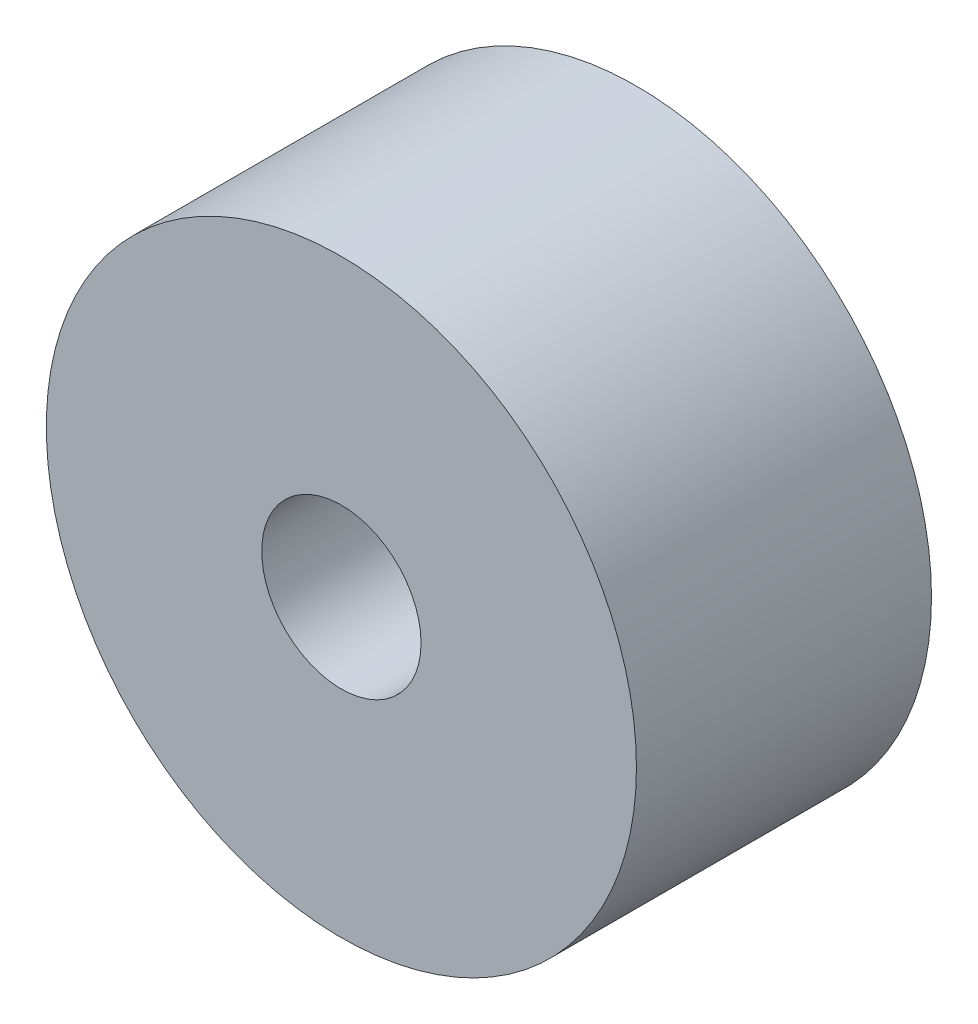
ISO-10303-21;
HEADER;
FILE_DESCRIPTION(('STEP AP214'),'2;1');
FILE_NAME('part.step','',(''),(''),'','','');
FILE_SCHEMA(('AUTOMOTIVE_DESIGN { 1 0 10303 214 1 1 1 1 }'));
ENDSEC;
DATA;
#1=APPLICATION_CONTEXT('core data for automotive mechanical design processes');
#2=APPLICATION_PROTOCOL_DEFINITION('international standard','automotive_design',2000,#1);
#3=PRODUCT_CONTEXT('',#1,'mechanical');
#4=PRODUCT('Part','Part','',(#3));
#5=PRODUCT_RELATED_PRODUCT_CATEGORY('part','',(#4));
#6=PRODUCT_DEFINITION_FORMATION('','',#4);
#7=PRODUCT_DEFINITION_CONTEXT('part definition',#1,'design');
#8=PRODUCT_DEFINITION('design','',#6,#7);
#9=PRODUCT_DEFINITION_SHAPE('','',#8);
#10=(LENGTH_UNIT() NAMED_UNIT(*) SI_UNIT(.MILLI.,.METRE.));
#11=(NAMED_UNIT(*) PLANE_ANGLE_UNIT() SI_UNIT($,.RADIAN.));
#12=(NAMED_UNIT(*) SI_UNIT($,.STERADIAN.) SOLID_ANGLE_UNIT());
#13=UNCERTAINTY_MEASURE_WITH_UNIT(LENGTH_MEASURE(1.E-05),#10,'distance_accuracy_value','');
#14=(GEOMETRIC_REPRESENTATION_CONTEXT(3) GLOBAL_UNCERTAINTY_ASSIGNED_CONTEXT((#13)) GLOBAL_UNIT_ASSIGNED_CONTEXT((#10,
#11,#12)) REPRESENTATION_CONTEXT('',''));
#15=CARTESIAN_POINT('',(0.,0.,0.));
#16=DIRECTION('',(0.,0.,1.));
#17=DIRECTION('',(1.,0.,0.));
#18=AXIS2_PLACEMENT_3D('',#15,#16,#17);
#19=CARTESIAN_POINT('',(0.,0.,10.));
#20=DIRECTION('',(0.,0.,1.));
#21=DIRECTION('',(1.,0.,0.));
#22=AXIS2_PLACEMENT_3D('',#19,#20,#21);
#23=PLANE('',#22);
#24=CARTESIAN_POINT('',(0.,0.,10.));
#25=DIRECTION('',(0.,0.,1.));
#26=DIRECTION('',(1.,0.,0.));
#27=AXIS2_PLACEMENT_3D('',#24,#25,#26);
#28=CIRCLE('',#27,10.);
#29=CARTESIAN_POINT('',(10.,0.,10.));
#30=VERTEX_POINT('',#29);
#31=EDGE_CURVE('E10',#30,#30,#28,.T.);
#32=ORIENTED_EDGE('',*,*,#31,.T.);
#33=EDGE_LOOP('',(#32));
#34=FACE_BOUND('',#33,.T.);
#35=CARTESIAN_POINT('',(0.,0.,10.));
#36=DIRECTION('',(0.,0.,1.));
#37=DIRECTION('',(1.,0.,0.));
#38=AXIS2_PLACEMENT_3D('',#35,#36,#37);
#39=CIRCLE('',#38,2.7);
#40=CARTESIAN_POINT('',(2.7,0.,10.));
#41=VERTEX_POINT('',#40);
#42=EDGE_CURVE('E50',#41,#41,#39,.T.);
#43=ORIENTED_EDGE('',*,*,#42,.F.);
#44=EDGE_LOOP('',(#43));
#45=FACE_BOUND('',#44,.T.);
#46=ADVANCED_FACE('F39',(#34,#45),#23,.T.);
#47=CARTESIAN_POINT('',(0.,0.,0.));
#48=DIRECTION('',(0.,0.,1.));
#49=DIRECTION('',(1.,0.,0.));
#50=AXIS2_PLACEMENT_3D('',#47,#48,#49);
#51=PLANE('',#50);
#52=CARTESIAN_POINT('',(0.,0.,0.));
#53=DIRECTION('',(0.,0.,1.));
#54=DIRECTION('',(1.,0.,0.));
#55=AXIS2_PLACEMENT_3D('',#52,#53,#54);
#56=CIRCLE('',#55,10.);
#57=CARTESIAN_POINT('',(10.,0.,0.));
#58=VERTEX_POINT('',#57);
#59=EDGE_CURVE('E43',#58,#58,#56,.T.);
#60=ORIENTED_EDGE('',*,*,#59,.F.);
#61=EDGE_LOOP('',(#60));
#62=FACE_BOUND('',#61,.T.);
#63=CARTESIAN_POINT('',(0.,0.,0.));
#64=DIRECTION('',(0.,0.,1.));
#65=DIRECTION('',(1.,0.,0.));
#66=AXIS2_PLACEMENT_3D('',#63,#64,#65);
#67=CIRCLE('',#66,2.7);
#68=CARTESIAN_POINT('',(2.7,0.,0.));
#69=VERTEX_POINT('',#68);
#70=EDGE_CURVE('E52',#69,#69,#67,.T.);
#71=ORIENTED_EDGE('',*,*,#70,.T.);
#72=EDGE_LOOP('',(#71));
#73=FACE_BOUND('',#72,.T.);
#74=ADVANCED_FACE('F62',(#62,#73),#51,.F.);
#75=CARTESIAN_POINT('',(0.,0.,10.));
#76=DIRECTION('',(0.,0.,-1.));
#77=DIRECTION('',(-1.,0.,0.));
#78=AXIS2_PLACEMENT_3D('',#75,#76,#77);
#79=CYLINDRICAL_SURFACE('',#78,10.);
#80=ORIENTED_EDGE('',*,*,#31,.F.);
#81=EDGE_LOOP('',(#80));
#82=FACE_BOUND('',#81,.T.);
#83=ORIENTED_EDGE('',*,*,#59,.T.);
#84=EDGE_LOOP('',(#83));
#85=FACE_BOUND('',#84,.T.);
#86=ADVANCED_FACE('F41',(#82,#85),#79,.T.);
#87=CARTESIAN_POINT('',(0.,0.,10.));
#88=DIRECTION('',(0.,0.,-1.));
#89=DIRECTION('',(-1.,0.,0.));
#90=AXIS2_PLACEMENT_3D('',#87,#88,#89);
#91=CYLINDRICAL_SURFACE('',#90,2.7);
#92=ORIENTED_EDGE('',*,*,#42,.T.);
#93=EDGE_LOOP('',(#92));
#94=FACE_BOUND('',#93,.T.);
#95=ORIENTED_EDGE('',*,*,#70,.F.);
#96=EDGE_LOOP('',(#95));
#97=FACE_BOUND('',#96,.T.);
#98=ADVANCED_FACE('F58',(#94,#97),#91,.F.);
#99=CLOSED_SHELL('',(#46,#74,#86,#98));
#100=MANIFOLD_SOLID_BREP('B2',#99);
#101=ADVANCED_BREP_SHAPE_REPRESENTATION('',(#18,#100),#14);
#102=SHAPE_DEFINITION_REPRESENTATION(#9,#101);
ENDSEC;
END-ISO-10303-21;
